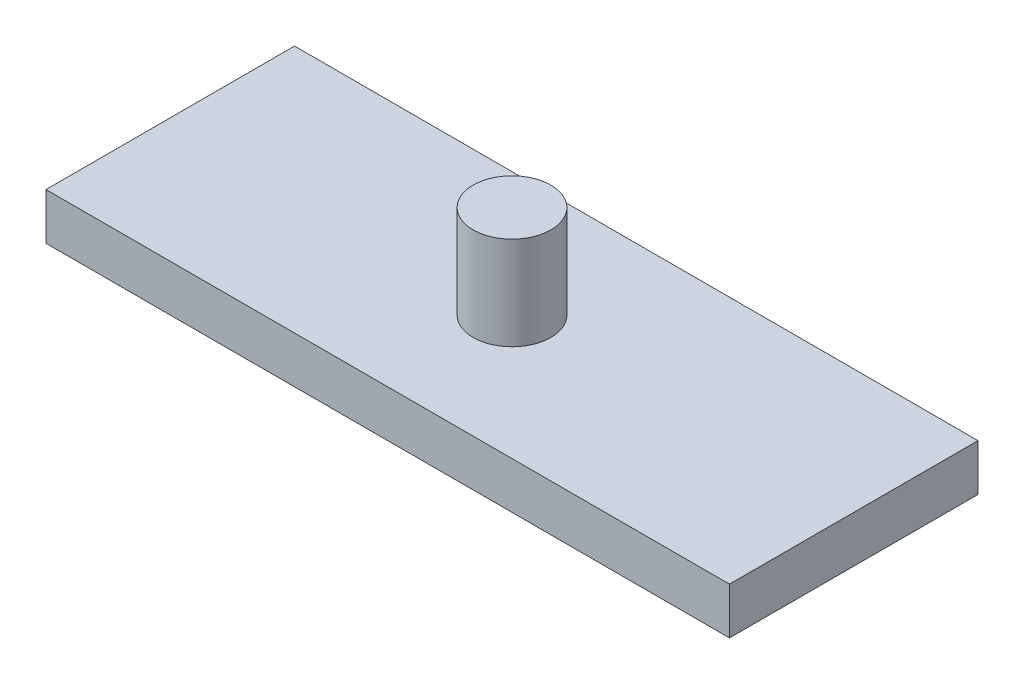
ISO-10303-21;
HEADER;
FILE_DESCRIPTION(('STEP AP214'),'2;1');
FILE_NAME('part.step','',(''),(''),'','','');
FILE_SCHEMA(('AUTOMOTIVE_DESIGN { 1 0 10303 214 1 1 1 1 }'));
ENDSEC;
DATA;
#1=APPLICATION_CONTEXT('core data for automotive mechanical design processes');
#2=APPLICATION_PROTOCOL_DEFINITION('international standard','automotive_design',2000,#1);
#3=PRODUCT_CONTEXT('',#1,'mechanical');
#4=PRODUCT('Part','Part','',(#3));
#5=PRODUCT_RELATED_PRODUCT_CATEGORY('part','',(#4));
#6=PRODUCT_DEFINITION_FORMATION('','',#4);
#7=PRODUCT_DEFINITION_CONTEXT('part definition',#1,'design');
#8=PRODUCT_DEFINITION('design','',#6,#7);
#9=PRODUCT_DEFINITION_SHAPE('','',#8);
#10=(LENGTH_UNIT() NAMED_UNIT(*) SI_UNIT(.MILLI.,.METRE.));
#11=(NAMED_UNIT(*) PLANE_ANGLE_UNIT() SI_UNIT($,.RADIAN.));
#12=(NAMED_UNIT(*) SI_UNIT($,.STERADIAN.) SOLID_ANGLE_UNIT());
#13=UNCERTAINTY_MEASURE_WITH_UNIT(LENGTH_MEASURE(1.E-05),#10,'distance_accuracy_value','');
#14=(GEOMETRIC_REPRESENTATION_CONTEXT(3) GLOBAL_UNCERTAINTY_ASSIGNED_CONTEXT((#13)) GLOBAL_UNIT_ASSIGNED_CONTEXT((#10,
#11,#12)) REPRESENTATION_CONTEXT('',''));
#15=CARTESIAN_POINT('',(0.,0.,0.));
#16=DIRECTION('',(0.,0.,1.));
#17=DIRECTION('',(1.,0.,0.));
#18=AXIS2_PLACEMENT_3D('',#15,#16,#17);
#19=CARTESIAN_POINT('',(-196.682719320126,-270.602297752567,-870.48614798632));
#20=DIRECTION('',(0.,1.,0.));
#21=DIRECTION('',(0.,0.,1.));
#22=AXIS2_PLACEMENT_3D('',#19,#20,#21);
#23=PLANE('',#22);
#24=CARTESIAN_POINT('',(-196.682719320126,-270.602297752567,-870.48614798632));
#25=DIRECTION('',(0.,-1.,0.));
#26=DIRECTION('',(0.,0.,-1.));
#27=AXIS2_PLACEMENT_3D('',#24,#25,#26);
#28=CIRCLE('',#27,12.5);
#29=CARTESIAN_POINT('',(-196.682719320126,-270.602297752567,-882.98614798632));
#30=VERTEX_POINT('',#29);
#31=EDGE_CURVE('E20',#30,#30,#28,.T.);
#32=ORIENTED_EDGE('',*,*,#31,.F.);
#33=EDGE_LOOP('',(#32));
#34=FACE_BOUND('',#33,.T.);
#35=ADVANCED_FACE('F17',(#34),#23,.T.);
#36=CARTESIAN_POINT('',(-196.682719320126,-270.602297752567,-870.48614798632));
#37=DIRECTION('',(0.,-1.,0.));
#38=DIRECTION('',(0.,0.,-1.));
#39=AXIS2_PLACEMENT_3D('',#36,#37,#38);
#40=CYLINDRICAL_SURFACE('',#39,12.5);
#41=CARTESIAN_POINT('',(-196.682719320126,-300.602297752566,-870.48614798632));
#42=DIRECTION('',(0.,-1.,0.));
#43=DIRECTION('',(0.,0.,-1.));
#44=AXIS2_PLACEMENT_3D('',#41,#42,#43);
#45=CIRCLE('',#44,12.5);
#46=CARTESIAN_POINT('',(-196.682719320126,-300.602297752566,-882.98614798632));
#47=VERTEX_POINT('',#46);
#48=EDGE_CURVE('E71',#47,#47,#45,.F.);
#49=ORIENTED_EDGE('',*,*,#48,.T.);
#50=EDGE_LOOP('',(#49));
#51=FACE_BOUND('',#50,.T.);
#52=ORIENTED_EDGE('',*,*,#31,.T.);
#53=EDGE_LOOP('',(#52));
#54=FACE_BOUND('',#53,.T.);
#55=ADVANCED_FACE('F97',(#51,#54),#40,.T.);
#56=CARTESIAN_POINT('',(-196.682719320126,-300.602297752566,-870.48614798632));
#57=DIRECTION('',(0.,-1.,0.));
#58=DIRECTION('',(0.,0.,-1.));
#59=AXIS2_PLACEMENT_3D('',#56,#57,#58);
#60=PLANE('',#59);
#61=ORIENTED_EDGE('',*,*,#48,.F.);
#62=EDGE_LOOP('',(#61));
#63=FACE_BOUND('',#62,.T.);
#64=DIRECTION('',(-1.,0.,0.));
#65=VECTOR('',#64,1.);
#66=CARTESIAN_POINT('',(-196.682719320126,-300.602297752566,-830.48614798632));
#67=LINE('',#66,#65);
#68=CARTESIAN_POINT('',(-306.682719320124,-300.602297752566,-830.48614798632));
#69=VERTEX_POINT('',#68);
#70=CARTESIAN_POINT('',(-86.6827193201278,-300.602297752566,-830.48614798632));
#71=VERTEX_POINT('',#70);
#72=EDGE_CURVE('E54',#69,#71,#67,.F.);
#73=ORIENTED_EDGE('',*,*,#72,.T.);
#74=DIRECTION('',(0.,0.,1.));
#75=VECTOR('',#74,1.);
#76=CARTESIAN_POINT('',(-86.6827193201278,-300.602297752566,-870.48614798632));
#77=LINE('',#76,#75);
#78=CARTESIAN_POINT('',(-86.6827193201278,-300.602297752566,-910.486147986318));
#79=VERTEX_POINT('',#78);
#80=EDGE_CURVE('E64',#71,#79,#77,.F.);
#81=ORIENTED_EDGE('',*,*,#80,.T.);
#82=DIRECTION('',(-1.,0.,0.));
#83=VECTOR('',#82,1.);
#84=CARTESIAN_POINT('',(-196.682719320126,-300.602297752566,-910.486147986318));
#85=LINE('',#84,#83);
#86=CARTESIAN_POINT('',(-306.682719320124,-300.602297752566,-910.486147986318));
#87=VERTEX_POINT('',#86);
#88=EDGE_CURVE('E59',#87,#79,#85,.F.);
#89=ORIENTED_EDGE('',*,*,#88,.F.);
#90=DIRECTION('',(0.,0.,-1.));
#91=VECTOR('',#90,1.);
#92=CARTESIAN_POINT('',(-306.682719320124,-300.602297752566,-870.48614798632));
#93=LINE('',#92,#91);
#94=EDGE_CURVE('E62',#87,#69,#93,.F.);
#95=ORIENTED_EDGE('',*,*,#94,.T.);
#96=EDGE_LOOP('',(#73,#81,#89,#95));
#97=FACE_BOUND('',#96,.T.);
#98=ADVANCED_FACE('F61',(#63,#97),#60,.F.);
#99=CARTESIAN_POINT('',(-196.682719320126,-308.102297752567,-910.486147986318));
#100=DIRECTION('',(0.,0.,-1.));
#101=DIRECTION('',(-1.,0.,0.));
#102=AXIS2_PLACEMENT_3D('',#99,#100,#101);
#103=PLANE('',#102);
#104=DIRECTION('',(0.,1.,0.));
#105=VECTOR('',#104,1.);
#106=CARTESIAN_POINT('',(-86.6827193201278,-308.102297752567,-910.486147986318));
#107=LINE('',#106,#105);
#108=CARTESIAN_POINT('',(-86.6827193201278,-315.602297752567,-910.486147986318));
#109=VERTEX_POINT('',#108);
#110=EDGE_CURVE('E198',#79,#109,#107,.F.);
#111=ORIENTED_EDGE('',*,*,#110,.T.);
#112=DIRECTION('',(1.,0.,0.));
#113=VECTOR('',#112,1.);
#114=CARTESIAN_POINT('',(-196.682719320126,-315.602297752567,-910.486147986318));
#115=LINE('',#114,#113);
#116=CARTESIAN_POINT('',(-306.682719320124,-315.602297752567,-910.486147986318));
#117=VERTEX_POINT('',#116);
#118=EDGE_CURVE('E82',#109,#117,#115,.F.);
#119=ORIENTED_EDGE('',*,*,#118,.T.);
#120=DIRECTION('',(0.,1.,0.));
#121=VECTOR('',#120,1.);
#122=CARTESIAN_POINT('',(-306.682719320124,-308.102297752567,-910.486147986318));
#123=LINE('',#122,#121);
#124=EDGE_CURVE('E70',#117,#87,#123,.T.);
#125=ORIENTED_EDGE('',*,*,#124,.T.);
#126=ORIENTED_EDGE('',*,*,#88,.T.);
#127=EDGE_LOOP('',(#111,#119,#125,#126));
#128=FACE_BOUND('',#127,.T.);
#129=ADVANCED_FACE('F81',(#128),#103,.T.);
#130=CARTESIAN_POINT('',(-306.682719320124,-308.102297752567,-870.48614798632));
#131=DIRECTION('',(1.,0.,0.));
#132=DIRECTION('',(0.,0.,-1.));
#133=AXIS2_PLACEMENT_3D('',#130,#131,#132);
#134=PLANE('',#133);
#135=DIRECTION('',(0.,1.,0.));
#136=VECTOR('',#135,1.);
#137=CARTESIAN_POINT('',(-306.682719320124,-308.102297752567,-830.48614798632));
#138=LINE('',#137,#136);
#139=CARTESIAN_POINT('',(-306.682719320124,-315.602297752567,-830.48614798632));
#140=VERTEX_POINT('',#139);
#141=EDGE_CURVE('E77',#140,#69,#138,.T.);
#142=ORIENTED_EDGE('',*,*,#141,.T.);
#143=ORIENTED_EDGE('',*,*,#94,.F.);
#144=ORIENTED_EDGE('',*,*,#124,.F.);
#145=DIRECTION('',(0.,0.,1.));
#146=VECTOR('',#145,1.);
#147=CARTESIAN_POINT('',(-306.682719320124,-315.602297752567,-870.48614798632));
#148=LINE('',#147,#146);
#149=EDGE_CURVE('E188',#117,#140,#148,.T.);
#150=ORIENTED_EDGE('',*,*,#149,.T.);
#151=EDGE_LOOP('',(#142,#143,#144,#150));
#152=FACE_BOUND('',#151,.T.);
#153=ADVANCED_FACE('F74',(#152),#134,.F.);
#154=CARTESIAN_POINT('',(-196.682719320126,-308.102297752567,-830.48614798632));
#155=DIRECTION('',(0.,0.,-1.));
#156=DIRECTION('',(-1.,0.,0.));
#157=AXIS2_PLACEMENT_3D('',#154,#155,#156);
#158=PLANE('',#157);
#159=DIRECTION('',(1.,0.,0.));
#160=VECTOR('',#159,1.);
#161=CARTESIAN_POINT('',(-196.682719320126,-315.602297752567,-830.48614798632));
#162=LINE('',#161,#160);
#163=CARTESIAN_POINT('',(-86.6827193201278,-315.602297752567,-830.48614798632));
#164=VERTEX_POINT('',#163);
#165=EDGE_CURVE('E27',#140,#164,#162,.T.);
#166=ORIENTED_EDGE('',*,*,#165,.T.);
#167=DIRECTION('',(0.,1.,0.));
#168=VECTOR('',#167,1.);
#169=CARTESIAN_POINT('',(-86.6827193201278,-308.102297752567,-830.48614798632));
#170=LINE('',#169,#168);
#171=EDGE_CURVE('E35',#164,#71,#170,.T.);
#172=ORIENTED_EDGE('',*,*,#171,.T.);
#173=ORIENTED_EDGE('',*,*,#72,.F.);
#174=ORIENTED_EDGE('',*,*,#141,.F.);
#175=EDGE_LOOP('',(#166,#172,#173,#174));
#176=FACE_BOUND('',#175,.T.);
#177=ADVANCED_FACE('F110',(#176),#158,.F.);
#178=CARTESIAN_POINT('',(-86.6827193201278,-308.102297752567,-870.48614798632));
#179=DIRECTION('',(-1.,0.,0.));
#180=DIRECTION('',(0.,0.,1.));
#181=AXIS2_PLACEMENT_3D('',#178,#179,#180);
#182=PLANE('',#181);
#183=ORIENTED_EDGE('',*,*,#171,.F.);
#184=DIRECTION('',(0.,0.,1.));
#185=VECTOR('',#184,1.);
#186=CARTESIAN_POINT('',(-86.6827193201278,-315.602297752567,-870.48614798632));
#187=LINE('',#186,#185);
#188=EDGE_CURVE('E11',#164,#109,#187,.F.);
#189=ORIENTED_EDGE('',*,*,#188,.T.);
#190=ORIENTED_EDGE('',*,*,#110,.F.);
#191=ORIENTED_EDGE('',*,*,#80,.F.);
#192=EDGE_LOOP('',(#183,#189,#190,#191));
#193=FACE_BOUND('',#192,.T.);
#194=ADVANCED_FACE('F105',(#193),#182,.F.);
#195=CARTESIAN_POINT('',(-196.682719320126,-315.602297752567,-870.48614798632));
#196=DIRECTION('',(0.,1.,0.));
#197=DIRECTION('',(0.,0.,1.));
#198=AXIS2_PLACEMENT_3D('',#195,#196,#197);
#199=PLANE('',#198);
#200=ORIENTED_EDGE('',*,*,#165,.F.);
#201=ORIENTED_EDGE('',*,*,#149,.F.);
#202=ORIENTED_EDGE('',*,*,#118,.F.);
#203=ORIENTED_EDGE('',*,*,#188,.F.);
#204=EDGE_LOOP('',(#200,#201,#202,#203));
#205=FACE_BOUND('',#204,.T.);
#206=ADVANCED_FACE('F103',(#205),#199,.F.);
#207=CLOSED_SHELL('',(#35,#55,#98,#129,#153,#177,#194,#206));
#208=MANIFOLD_SOLID_BREP('B1',#207);
#209=ADVANCED_BREP_SHAPE_REPRESENTATION('',(#18,#208),#14);
#210=SHAPE_DEFINITION_REPRESENTATION(#9,#209);
ENDSEC;
END-ISO-10303-21;
